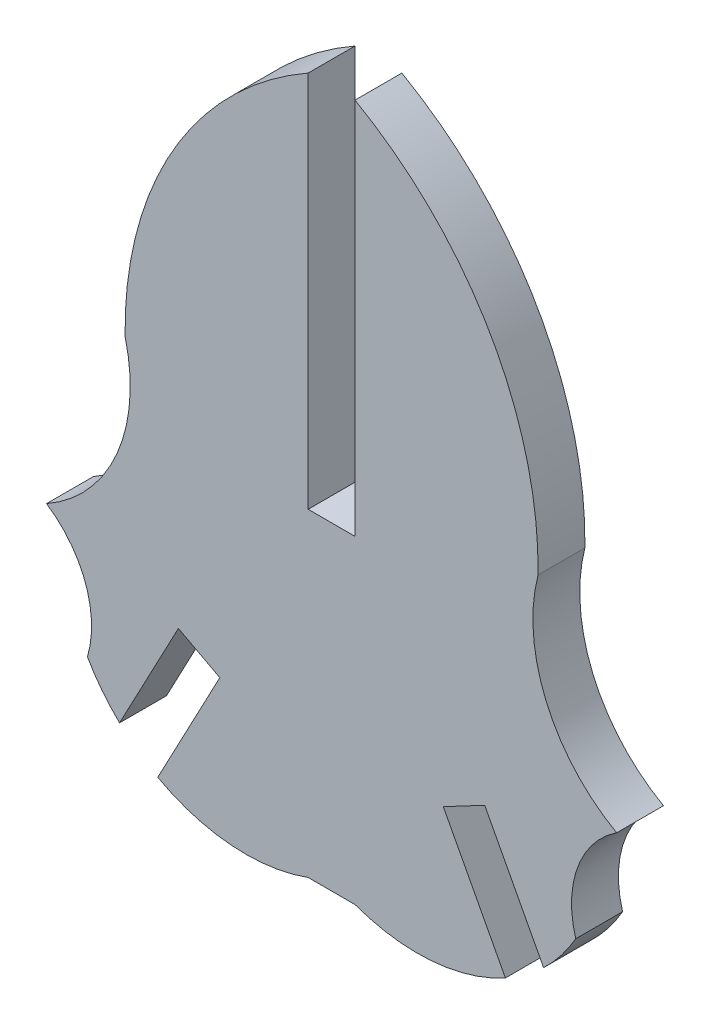
ISO-10303-21;
HEADER;
FILE_DESCRIPTION(('STEP AP214'),'2;1');
FILE_NAME('part.step','',(''),(''),'','','');
FILE_SCHEMA(('AUTOMOTIVE_DESIGN { 1 0 10303 214 1 1 1 1 }'));
ENDSEC;
DATA;
#1=APPLICATION_CONTEXT('core data for automotive mechanical design processes');
#2=APPLICATION_PROTOCOL_DEFINITION('international standard','automotive_design',2000,#1);
#3=PRODUCT_CONTEXT('',#1,'mechanical');
#4=PRODUCT('Part','Part','',(#3));
#5=PRODUCT_RELATED_PRODUCT_CATEGORY('part','',(#4));
#6=PRODUCT_DEFINITION_FORMATION('','',#4);
#7=PRODUCT_DEFINITION_CONTEXT('part definition',#1,'design');
#8=PRODUCT_DEFINITION('design','',#6,#7);
#9=PRODUCT_DEFINITION_SHAPE('','',#8);
#10=(LENGTH_UNIT() NAMED_UNIT(*) SI_UNIT(.MILLI.,.METRE.));
#11=(NAMED_UNIT(*) PLANE_ANGLE_UNIT() SI_UNIT($,.RADIAN.));
#12=(NAMED_UNIT(*) SI_UNIT($,.STERADIAN.) SOLID_ANGLE_UNIT());
#13=UNCERTAINTY_MEASURE_WITH_UNIT(LENGTH_MEASURE(1.E-05),#10,'distance_accuracy_value','');
#14=(GEOMETRIC_REPRESENTATION_CONTEXT(3) GLOBAL_UNCERTAINTY_ASSIGNED_CONTEXT((#13)) GLOBAL_UNIT_ASSIGNED_CONTEXT((#10,
#11,#12)) REPRESENTATION_CONTEXT('',''));
#15=CARTESIAN_POINT('',(0.,0.,0.));
#16=DIRECTION('',(0.,0.,1.));
#17=DIRECTION('',(1.,0.,0.));
#18=AXIS2_PLACEMENT_3D('',#15,#16,#17);
#19=CARTESIAN_POINT('',(1.524,114.851197300558,1.524));
#20=DIRECTION('',(1.,0.,0.));
#21=DIRECTION('',(0.,0.,-1.));
#22=AXIS2_PLACEMENT_3D('',#19,#20,#21);
#23=PLANE('',#22);
#24=DIRECTION('',(0.,-1.,0.));
#25=VECTOR('',#24,1.);
#26=CARTESIAN_POINT('',(1.524,114.851197300558,0.));
#27=LINE('',#26,#25);
#28=CARTESIAN_POINT('',(1.524,127.137521288262,0.));
#29=VERTEX_POINT('',#28);
#30=CARTESIAN_POINT('',(1.524,114.851197300558,0.));
#31=VERTEX_POINT('',#30);
#32=EDGE_CURVE('E201',#29,#31,#27,.T.);
#33=ORIENTED_EDGE('',*,*,#32,.T.);
#34=DIRECTION('',(0.,0.,-1.));
#35=VECTOR('',#34,1.);
#36=CARTESIAN_POINT('',(1.524,114.851197300558,1.524));
#37=LINE('',#36,#35);
#38=CARTESIAN_POINT('',(1.524,114.851197300558,1.524));
#39=VERTEX_POINT('',#38);
#40=EDGE_CURVE('E11',#39,#31,#37,.T.);
#41=ORIENTED_EDGE('',*,*,#40,.F.);
#42=DIRECTION('',(0.,-1.,0.));
#43=VECTOR('',#42,1.);
#44=CARTESIAN_POINT('',(1.524,114.851197300558,1.524));
#45=LINE('',#44,#43);
#46=CARTESIAN_POINT('',(1.524,127.137521288262,1.524));
#47=VERTEX_POINT('',#46);
#48=EDGE_CURVE('E239',#47,#39,#45,.T.);
#49=ORIENTED_EDGE('',*,*,#48,.F.);
#50=DIRECTION('',(0.,0.,-1.));
#51=VECTOR('',#50,1.);
#52=CARTESIAN_POINT('',(1.524,127.137521288262,1.524));
#53=LINE('',#52,#51);
#54=EDGE_CURVE('E197',#47,#29,#53,.T.);
#55=ORIENTED_EDGE('',*,*,#54,.T.);
#56=EDGE_LOOP('',(#33,#41,#49,#55));
#57=FACE_BOUND('',#56,.T.);
#58=ADVANCED_FACE('F33',(#57),#23,.F.);
#59=CARTESIAN_POINT('',(0.,114.851197300558,1.524));
#60=DIRECTION('',(0.,-1.,0.));
#61=DIRECTION('',(0.,0.,-1.));
#62=AXIS2_PLACEMENT_3D('',#59,#60,#61);
#63=PLANE('',#62);
#64=DIRECTION('',(-1.,0.,0.));
#65=VECTOR('',#64,1.);
#66=CARTESIAN_POINT('',(0.,114.851197300558,0.));
#67=LINE('',#66,#65);
#68=CARTESIAN_POINT('',(0.,114.851197300558,0.));
#69=VERTEX_POINT('',#68);
#70=EDGE_CURVE('E204',#31,#69,#67,.T.);
#71=ORIENTED_EDGE('',*,*,#70,.T.);
#72=DIRECTION('',(0.,0.,-1.));
#73=VECTOR('',#72,1.);
#74=CARTESIAN_POINT('',(0.,114.851197300558,1.524));
#75=LINE('',#74,#73);
#76=CARTESIAN_POINT('',(0.,114.851197300558,1.524));
#77=VERTEX_POINT('',#76);
#78=EDGE_CURVE('E41',#77,#69,#75,.T.);
#79=ORIENTED_EDGE('',*,*,#78,.F.);
#80=DIRECTION('',(-1.,0.,0.));
#81=VECTOR('',#80,1.);
#82=CARTESIAN_POINT('',(0.,114.851197300558,1.524));
#83=LINE('',#82,#81);
#84=EDGE_CURVE('E128',#39,#77,#83,.T.);
#85=ORIENTED_EDGE('',*,*,#84,.F.);
#86=ORIENTED_EDGE('',*,*,#40,.T.);
#87=EDGE_LOOP('',(#71,#79,#85,#86));
#88=FACE_BOUND('',#87,.T.);
#89=ADVANCED_FACE('F357',(#88),#63,.F.);
#90=CARTESIAN_POINT('',(0.,114.851197300558,1.524));
#91=DIRECTION('',(-1.,0.,0.));
#92=DIRECTION('',(0.,0.,1.));
#93=AXIS2_PLACEMENT_3D('',#90,#91,#92);
#94=PLANE('',#93);
#95=DIRECTION('',(0.,1.,0.));
#96=VECTOR('',#95,1.);
#97=CARTESIAN_POINT('',(0.,114.851197300558,0.));
#98=LINE('',#97,#96);
#99=CARTESIAN_POINT('',(0.,127.137521288262,0.));
#100=VERTEX_POINT('',#99);
#101=EDGE_CURVE('E206',#69,#100,#98,.T.);
#102=ORIENTED_EDGE('',*,*,#101,.T.);
#103=DIRECTION('',(0.,0.,-1.));
#104=VECTOR('',#103,1.);
#105=CARTESIAN_POINT('',(0.,127.137521288262,1.524));
#106=LINE('',#105,#104);
#107=CARTESIAN_POINT('',(0.,127.137521288262,1.524));
#108=VERTEX_POINT('',#107);
#109=EDGE_CURVE('E282',#108,#100,#106,.T.);
#110=ORIENTED_EDGE('',*,*,#109,.F.);
#111=DIRECTION('',(0.,1.,0.));
#112=VECTOR('',#111,1.);
#113=CARTESIAN_POINT('',(0.,114.851197300558,1.524));
#114=LINE('',#113,#112);
#115=EDGE_CURVE('E290',#77,#108,#114,.T.);
#116=ORIENTED_EDGE('',*,*,#115,.F.);
#117=ORIENTED_EDGE('',*,*,#78,.T.);
#118=EDGE_LOOP('',(#102,#110,#116,#117));
#119=FACE_BOUND('',#118,.T.);
#120=ADVANCED_FACE('F288',(#119),#94,.F.);
#121=CARTESIAN_POINT('',(5.7953461840348,116.916816544472,1.524));
#122=DIRECTION('',(0.,0.,-1.));
#123=DIRECTION('',(-1.,0.,0.));
#124=AXIS2_PLACEMENT_3D('',#121,#122,#123);
#125=CYLINDRICAL_SURFACE('',#124,11.7494188304156);
#126=CARTESIAN_POINT('',(5.7953461840348,116.916816544472,0.));
#127=DIRECTION('',(0.,0.,1.));
#128=DIRECTION('',(1.,0.,0.));
#129=AXIS2_PLACEMENT_3D('',#126,#127,#128);
#130=CIRCLE('',#129,11.7494188304156);
#131=CARTESIAN_POINT('',(-5.95274690538247,116.740318343602,0.));
#132=VERTEX_POINT('',#131);
#133=EDGE_CURVE('E208',#100,#132,#130,.T.);
#134=ORIENTED_EDGE('',*,*,#133,.T.);
#135=DIRECTION('',(0.,0.,-1.));
#136=VECTOR('',#135,1.);
#137=CARTESIAN_POINT('',(-5.95274690538247,116.740318343602,1.524));
#138=LINE('',#137,#136);
#139=CARTESIAN_POINT('',(-5.95274690538247,116.740318343602,1.524));
#140=VERTEX_POINT('',#139);
#141=EDGE_CURVE('E279',#140,#132,#138,.T.);
#142=ORIENTED_EDGE('',*,*,#141,.F.);
#143=CARTESIAN_POINT('',(5.7953461840348,116.916816544472,1.524));
#144=DIRECTION('',(0.,0.,1.));
#145=DIRECTION('',(1.,0.,0.));
#146=AXIS2_PLACEMENT_3D('',#143,#144,#145);
#147=CIRCLE('',#146,11.7494188304156);
#148=EDGE_CURVE('E308',#108,#140,#147,.T.);
#149=ORIENTED_EDGE('',*,*,#148,.F.);
#150=ORIENTED_EDGE('',*,*,#109,.T.);
#151=EDGE_LOOP('',(#134,#142,#149,#150));
#152=FACE_BOUND('',#151,.T.);
#153=ADVANCED_FACE('F299',(#152),#125,.T.);
#154=CARTESIAN_POINT('',(-11.1300085073487,115.413975941409,1.524));
#155=DIRECTION('',(0.,0.,-1.));
#156=DIRECTION('',(-1.,0.,0.));
#157=AXIS2_PLACEMENT_3D('',#154,#155,#156);
#158=CYLINDRICAL_SURFACE('',#157,5.34445711583969);
#159=CARTESIAN_POINT('',(-11.1300085073487,115.413975941409,0.));
#160=DIRECTION('',(0.,0.,-1.));
#161=DIRECTION('',(-1.,0.,0.));
#162=AXIS2_PLACEMENT_3D('',#159,#160,#161);
#163=CIRCLE('',#162,5.34445711583969);
#164=CARTESIAN_POINT('',(-8.50870740255857,110.756508562986,0.));
#165=VERTEX_POINT('',#164);
#166=EDGE_CURVE('E210',#132,#165,#163,.T.);
#167=ORIENTED_EDGE('',*,*,#166,.T.);
#168=DIRECTION('',(0.,0.,-1.));
#169=VECTOR('',#168,1.);
#170=CARTESIAN_POINT('',(-8.50870740255857,110.756508562986,1.524));
#171=LINE('',#170,#169);
#172=CARTESIAN_POINT('',(-8.50870740255857,110.756508562986,1.524));
#173=VERTEX_POINT('',#172);
#174=EDGE_CURVE('E276',#173,#165,#171,.T.);
#175=ORIENTED_EDGE('',*,*,#174,.F.);
#176=CARTESIAN_POINT('',(-11.1300085073487,115.413975941409,1.524));
#177=DIRECTION('',(0.,0.,-1.));
#178=DIRECTION('',(-1.,0.,0.));
#179=AXIS2_PLACEMENT_3D('',#176,#177,#178);
#180=CIRCLE('',#179,5.34445711583969);
#181=EDGE_CURVE('E305',#140,#173,#180,.T.);
#182=ORIENTED_EDGE('',*,*,#181,.F.);
#183=ORIENTED_EDGE('',*,*,#141,.T.);
#184=EDGE_LOOP('',(#167,#175,#182,#183));
#185=FACE_BOUND('',#184,.T.);
#186=ADVANCED_FACE('F303',(#185),#158,.F.);
#187=CARTESIAN_POINT('',(-10.2981873988656,108.036270692932,1.524));
#188=DIRECTION('',(0.,0.,-1.));
#189=DIRECTION('',(-1.,0.,0.));
#190=AXIS2_PLACEMENT_3D('',#187,#188,#189);
#191=CYLINDRICAL_SURFACE('',#190,3.25606092185918);
#192=CARTESIAN_POINT('',(-10.2981873988656,108.036270692932,0.));
#193=DIRECTION('',(0.,0.,-1.));
#194=DIRECTION('',(1.,0.,0.));
#195=AXIS2_PLACEMENT_3D('',#192,#193,#194);
#196=CIRCLE('',#195,3.25606092185918);
#197=CARTESIAN_POINT('',(-7.17791901668704,107.105755808561,0.));
#198=VERTEX_POINT('',#197);
#199=EDGE_CURVE('E212',#165,#198,#196,.T.);
#200=ORIENTED_EDGE('',*,*,#199,.T.);
#201=DIRECTION('',(0.,0.,-1.));
#202=VECTOR('',#201,1.);
#203=CARTESIAN_POINT('',(-7.17791901668704,107.105755808561,1.524));
#204=LINE('',#203,#202);
#205=CARTESIAN_POINT('',(-7.17791901668704,107.105755808561,1.524));
#206=VERTEX_POINT('',#205);
#207=EDGE_CURVE('E273',#206,#198,#204,.T.);
#208=ORIENTED_EDGE('',*,*,#207,.F.);
#209=CARTESIAN_POINT('',(-10.2981873988656,108.036270692932,1.524));
#210=DIRECTION('',(0.,0.,-1.));
#211=DIRECTION('',(1.,0.,0.));
#212=AXIS2_PLACEMENT_3D('',#209,#210,#211);
#213=CIRCLE('',#212,3.25606092185918);
#214=EDGE_CURVE('E307',#173,#206,#213,.T.);
#215=ORIENTED_EDGE('',*,*,#214,.F.);
#216=ORIENTED_EDGE('',*,*,#174,.T.);
#217=EDGE_LOOP('',(#200,#208,#215,#216));
#218=FACE_BOUND('',#217,.T.);
#219=ADVANCED_FACE('F370',(#218),#191,.F.);
#220=CARTESIAN_POINT('',(-2.02983197494485,110.055759341289,1.524));
#221=DIRECTION('',(0.,0.,-1.));
#222=DIRECTION('',(-1.,0.,0.));
#223=AXIS2_PLACEMENT_3D('',#220,#221,#222);
#224=CYLINDRICAL_SURFACE('',#223,5.93340720264993);
#225=CARTESIAN_POINT('',(-2.02983197494485,110.055759341289,0.));
#226=DIRECTION('',(0.,0.,1.));
#227=DIRECTION('',(-1.,0.,0.));
#228=AXIS2_PLACEMENT_3D('',#225,#226,#227);
#229=CIRCLE('',#228,5.93340720264993);
#230=CARTESIAN_POINT('',(-6.13265444949957,105.76948254496,0.));
#231=VERTEX_POINT('',#230);
#232=EDGE_CURVE('E214',#198,#231,#229,.T.);
#233=ORIENTED_EDGE('',*,*,#232,.T.);
#234=DIRECTION('',(0.,0.,-1.));
#235=VECTOR('',#234,1.);
#236=CARTESIAN_POINT('',(-6.13265444949957,105.76948254496,1.524));
#237=LINE('',#236,#235);
#238=CARTESIAN_POINT('',(-6.13265444949957,105.76948254496,1.524));
#239=VERTEX_POINT('',#238);
#240=EDGE_CURVE('E270',#239,#231,#237,.T.);
#241=ORIENTED_EDGE('',*,*,#240,.F.);
#242=CARTESIAN_POINT('',(-2.02983197494485,110.055759341289,1.524));
#243=DIRECTION('',(0.,0.,1.));
#244=DIRECTION('',(-1.,0.,0.));
#245=AXIS2_PLACEMENT_3D('',#242,#243,#244);
#246=CIRCLE('',#245,5.93340720264993);
#247=EDGE_CURVE('E310',#206,#239,#246,.T.);
#248=ORIENTED_EDGE('',*,*,#247,.F.);
#249=ORIENTED_EDGE('',*,*,#207,.T.);
#250=EDGE_LOOP('',(#233,#241,#248,#249));
#251=FACE_BOUND('',#250,.T.);
#252=ADVANCED_FACE('F373',(#251),#224,.T.);
#253=CARTESIAN_POINT('',(-6.13265444949957,105.76948254496,1.524));
#254=DIRECTION('',(-0.88386141755622,0.467748858422453,0.));
#255=DIRECTION('',(-0.467748858422453,-0.883861417556221,0.));
#256=AXIS2_PLACEMENT_3D('',#253,#254,#255);
#257=PLANE('',#256);
#258=DIRECTION('',(0.467748858422453,0.88386141755622,0.));
#259=VECTOR('',#258,1.);
#260=CARTESIAN_POINT('',(-6.13265444949957,105.76948254496,0.));
#261=LINE('',#260,#259);
#262=CARTESIAN_POINT('',(-4.21858354193314,109.386323922982,0.));
#263=VERTEX_POINT('',#262);
#264=EDGE_CURVE('E216',#231,#263,#261,.T.);
#265=ORIENTED_EDGE('',*,*,#264,.T.);
#266=DIRECTION('',(0.,0.,-1.));
#267=VECTOR('',#266,1.);
#268=CARTESIAN_POINT('',(-4.21858354193314,109.386323922982,1.524));
#269=LINE('',#268,#267);
#270=CARTESIAN_POINT('',(-4.21858354193314,109.386323922982,1.524));
#271=VERTEX_POINT('',#270);
#272=EDGE_CURVE('E267',#271,#263,#269,.T.);
#273=ORIENTED_EDGE('',*,*,#272,.F.);
#274=DIRECTION('',(0.467748858422453,0.88386141755622,0.));
#275=VECTOR('',#274,1.);
#276=CARTESIAN_POINT('',(-6.13265444949957,105.76948254496,1.524));
#277=LINE('',#276,#275);
#278=EDGE_CURVE('E316',#239,#271,#277,.T.);
#279=ORIENTED_EDGE('',*,*,#278,.F.);
#280=ORIENTED_EDGE('',*,*,#240,.T.);
#281=EDGE_LOOP('',(#265,#273,#279,#280));
#282=FACE_BOUND('',#281,.T.);
#283=ADVANCED_FACE('F377',(#282),#257,.F.);
#284=CARTESIAN_POINT('',(-4.21858354193314,109.386323922982,1.524));
#285=DIRECTION('',(0.467748858422454,0.88386141755622,0.));
#286=DIRECTION('',(-0.88386141755622,0.467748858422455,0.));
#287=AXIS2_PLACEMENT_3D('',#284,#285,#286);
#288=PLANE('',#287);
#289=DIRECTION('',(0.88386141755622,-0.467748858422454,0.));
#290=VECTOR('',#289,1.);
#291=CARTESIAN_POINT('',(-4.21858354193314,109.386323922982,0.));
#292=LINE('',#291,#290);
#293=CARTESIAN_POINT('',(-2.87157874157746,108.673474662746,0.));
#294=VERTEX_POINT('',#293);
#295=EDGE_CURVE('E218',#263,#294,#292,.T.);
#296=ORIENTED_EDGE('',*,*,#295,.T.);
#297=DIRECTION('',(0.,0.,-1.));
#298=VECTOR('',#297,1.);
#299=CARTESIAN_POINT('',(-2.87157874157746,108.673474662746,1.524));
#300=LINE('',#299,#298);
#301=CARTESIAN_POINT('',(-2.87157874157746,108.673474662746,1.524));
#302=VERTEX_POINT('',#301);
#303=EDGE_CURVE('E264',#302,#294,#300,.T.);
#304=ORIENTED_EDGE('',*,*,#303,.F.);
#305=DIRECTION('',(0.88386141755622,-0.467748858422454,0.));
#306=VECTOR('',#305,1.);
#307=CARTESIAN_POINT('',(-4.21858354193314,109.386323922982,1.524));
#308=LINE('',#307,#306);
#309=EDGE_CURVE('E318',#271,#302,#308,.T.);
#310=ORIENTED_EDGE('',*,*,#309,.F.);
#311=ORIENTED_EDGE('',*,*,#272,.T.);
#312=EDGE_LOOP('',(#296,#304,#310,#311));
#313=FACE_BOUND('',#312,.T.);
#314=ADVANCED_FACE('F381',(#313),#288,.F.);
#315=CARTESIAN_POINT('',(-4.89091282582464,104.857727271631,1.524));
#316=DIRECTION('',(0.88386141755622,-0.467748858422454,0.));
#317=DIRECTION('',(0.467748858422454,0.88386141755622,0.));
#318=AXIS2_PLACEMENT_3D('',#315,#316,#317);
#319=PLANE('',#318);
#320=DIRECTION('',(-0.467748858422454,-0.88386141755622,0.));
#321=VECTOR('',#320,1.);
#322=CARTESIAN_POINT('',(-4.89091282582464,104.857727271631,0.));
#323=LINE('',#322,#321);
#324=CARTESIAN_POINT('',(-4.89091282582464,104.857727271631,0.));
#325=VERTEX_POINT('',#324);
#326=EDGE_CURVE('E220',#294,#325,#323,.T.);
#327=ORIENTED_EDGE('',*,*,#326,.T.);
#328=DIRECTION('',(0.,0.,-1.));
#329=VECTOR('',#328,1.);
#330=CARTESIAN_POINT('',(-4.89091282582464,104.857727271631,1.524));
#331=LINE('',#330,#329);
#332=CARTESIAN_POINT('',(-4.89091282582464,104.857727271631,1.524));
#333=VERTEX_POINT('',#332);
#334=EDGE_CURVE('E261',#333,#325,#331,.T.);
#335=ORIENTED_EDGE('',*,*,#334,.F.);
#336=DIRECTION('',(-0.467748858422454,-0.88386141755622,0.));
#337=VECTOR('',#336,1.);
#338=CARTESIAN_POINT('',(-4.89091282582464,104.857727271631,1.524));
#339=LINE('',#338,#337);
#340=EDGE_CURVE('E320',#302,#333,#339,.T.);
#341=ORIENTED_EDGE('',*,*,#340,.F.);
#342=ORIENTED_EDGE('',*,*,#303,.T.);
#343=EDGE_LOOP('',(#327,#335,#341,#342));
#344=FACE_BOUND('',#343,.T.);
#345=ADVANCED_FACE('F385',(#344),#319,.F.);
#346=CARTESIAN_POINT('',(-2.02983197494485,110.055759341289,1.524));
#347=DIRECTION('',(0.,0.,-1.));
#348=DIRECTION('',(-1.,0.,0.));
#349=AXIS2_PLACEMENT_3D('',#346,#347,#348);
#350=CYLINDRICAL_SURFACE('',#349,5.93340720264992);
#351=CARTESIAN_POINT('',(-2.02983197494485,110.055759341289,0.));
#352=DIRECTION('',(0.,0.,1.));
#353=DIRECTION('',(-1.,0.,0.));
#354=AXIS2_PLACEMENT_3D('',#351,#352,#353);
#355=CIRCLE('',#354,5.93340720264992);
#356=CARTESIAN_POINT('',(0.,104.480357724728,0.));
#357=VERTEX_POINT('',#356);
#358=EDGE_CURVE('E222',#325,#357,#355,.T.);
#359=ORIENTED_EDGE('',*,*,#358,.T.);
#360=DIRECTION('',(0.,0.,-1.));
#361=VECTOR('',#360,1.);
#362=CARTESIAN_POINT('',(0.,104.480357724728,1.524));
#363=LINE('',#362,#361);
#364=CARTESIAN_POINT('',(0.,104.480357724728,1.524));
#365=VERTEX_POINT('',#364);
#366=EDGE_CURVE('E258',#365,#357,#363,.T.);
#367=ORIENTED_EDGE('',*,*,#366,.F.);
#368=CARTESIAN_POINT('',(-2.02983197494485,110.055759341289,1.524));
#369=DIRECTION('',(0.,0.,1.));
#370=DIRECTION('',(-1.,0.,0.));
#371=AXIS2_PLACEMENT_3D('',#368,#369,#370);
#372=CIRCLE('',#371,5.93340720264992);
#373=EDGE_CURVE('E322',#333,#365,#372,.T.);
#374=ORIENTED_EDGE('',*,*,#373,.F.);
#375=ORIENTED_EDGE('',*,*,#334,.T.);
#376=EDGE_LOOP('',(#359,#367,#374,#375));
#377=FACE_BOUND('',#376,.T.);
#378=ADVANCED_FACE('F389',(#377),#350,.T.);
#379=CARTESIAN_POINT('',(0.,104.480357724728,1.524));
#380=DIRECTION('',(0.,1.,0.));
#381=DIRECTION('',(0.,0.,1.));
#382=AXIS2_PLACEMENT_3D('',#379,#380,#381);
#383=PLANE('',#382);
#384=DIRECTION('',(1.,0.,0.));
#385=VECTOR('',#384,1.);
#386=CARTESIAN_POINT('',(0.,104.480357724728,0.));
#387=LINE('',#386,#385);
#388=CARTESIAN_POINT('',(1.524,104.480357724728,0.));
#389=VERTEX_POINT('',#388);
#390=EDGE_CURVE('E224',#357,#389,#387,.T.);
#391=ORIENTED_EDGE('',*,*,#390,.T.);
#392=DIRECTION('',(0.,0.,-1.));
#393=VECTOR('',#392,1.);
#394=CARTESIAN_POINT('',(1.524,104.480357724728,1.524));
#395=LINE('',#394,#393);
#396=CARTESIAN_POINT('',(1.524,104.480357724728,1.524));
#397=VERTEX_POINT('',#396);
#398=EDGE_CURVE('E255',#397,#389,#395,.T.);
#399=ORIENTED_EDGE('',*,*,#398,.F.);
#400=DIRECTION('',(1.,0.,0.));
#401=VECTOR('',#400,1.);
#402=CARTESIAN_POINT('',(0.,104.480357724728,1.524));
#403=LINE('',#402,#401);
#404=EDGE_CURVE('E324',#365,#397,#403,.T.);
#405=ORIENTED_EDGE('',*,*,#404,.F.);
#406=ORIENTED_EDGE('',*,*,#366,.T.);
#407=EDGE_LOOP('',(#391,#399,#405,#406));
#408=FACE_BOUND('',#407,.T.);
#409=ADVANCED_FACE('F393',(#408),#383,.F.);
#410=CARTESIAN_POINT('',(3.55383197494485,110.055759341289,1.524));
#411=DIRECTION('',(0.,0.,-1.));
#412=DIRECTION('',(-1.,0.,0.));
#413=AXIS2_PLACEMENT_3D('',#410,#411,#412);
#414=CYLINDRICAL_SURFACE('',#413,5.93340720264992);
#415=CARTESIAN_POINT('',(3.55383197494485,110.055759341289,0.));
#416=DIRECTION('',(0.,0.,1.));
#417=DIRECTION('',(1.,0.,0.));
#418=AXIS2_PLACEMENT_3D('',#415,#416,#417);
#419=CIRCLE('',#418,5.93340720264992);
#420=CARTESIAN_POINT('',(6.41491282582464,104.857727271631,0.));
#421=VERTEX_POINT('',#420);
#422=EDGE_CURVE('E226',#389,#421,#419,.T.);
#423=ORIENTED_EDGE('',*,*,#422,.T.);
#424=DIRECTION('',(0.,0.,-1.));
#425=VECTOR('',#424,1.);
#426=CARTESIAN_POINT('',(6.41491282582464,104.857727271631,1.524));
#427=LINE('',#426,#425);
#428=CARTESIAN_POINT('',(6.41491282582464,104.857727271631,1.524));
#429=VERTEX_POINT('',#428);
#430=EDGE_CURVE('E252',#429,#421,#427,.T.);
#431=ORIENTED_EDGE('',*,*,#430,.F.);
#432=CARTESIAN_POINT('',(3.55383197494485,110.055759341289,1.524));
#433=DIRECTION('',(0.,0.,1.));
#434=DIRECTION('',(1.,0.,0.));
#435=AXIS2_PLACEMENT_3D('',#432,#433,#434);
#436=CIRCLE('',#435,5.93340720264992);
#437=EDGE_CURVE('E326',#397,#429,#436,.T.);
#438=ORIENTED_EDGE('',*,*,#437,.F.);
#439=ORIENTED_EDGE('',*,*,#398,.T.);
#440=EDGE_LOOP('',(#423,#431,#438,#439));
#441=FACE_BOUND('',#440,.T.);
#442=ADVANCED_FACE('F397',(#441),#414,.T.);
#443=CARTESIAN_POINT('',(6.41491282582464,104.857727271631,1.524));
#444=DIRECTION('',(-0.88386141755622,-0.467748858422454,0.));
#445=DIRECTION('',(0.467748858422454,-0.88386141755622,0.));
#446=AXIS2_PLACEMENT_3D('',#443,#444,#445);
#447=PLANE('',#446);
#448=DIRECTION('',(-0.467748858422454,0.88386141755622,0.));
#449=VECTOR('',#448,1.);
#450=CARTESIAN_POINT('',(6.41491282582464,104.857727271631,0.));
#451=LINE('',#450,#449);
#452=CARTESIAN_POINT('',(4.39557874157746,108.673474662746,0.));
#453=VERTEX_POINT('',#452);
#454=EDGE_CURVE('E228',#421,#453,#451,.T.);
#455=ORIENTED_EDGE('',*,*,#454,.T.);
#456=DIRECTION('',(0.,0.,-1.));
#457=VECTOR('',#456,1.);
#458=CARTESIAN_POINT('',(4.39557874157746,108.673474662746,1.524));
#459=LINE('',#458,#457);
#460=CARTESIAN_POINT('',(4.39557874157746,108.673474662746,1.524));
#461=VERTEX_POINT('',#460);
#462=EDGE_CURVE('E249',#461,#453,#459,.T.);
#463=ORIENTED_EDGE('',*,*,#462,.F.);
#464=DIRECTION('',(-0.467748858422454,0.88386141755622,0.));
#465=VECTOR('',#464,1.);
#466=CARTESIAN_POINT('',(6.41491282582464,104.857727271631,1.524));
#467=LINE('',#466,#465);
#468=EDGE_CURVE('E328',#429,#461,#467,.T.);
#469=ORIENTED_EDGE('',*,*,#468,.F.);
#470=ORIENTED_EDGE('',*,*,#430,.T.);
#471=EDGE_LOOP('',(#455,#463,#469,#470));
#472=FACE_BOUND('',#471,.T.);
#473=ADVANCED_FACE('F401',(#472),#447,.F.);
#474=CARTESIAN_POINT('',(5.74258354193314,109.386323922982,1.524));
#475=DIRECTION('',(-0.467748858422454,0.88386141755622,0.));
#476=DIRECTION('',(-0.88386141755622,-0.467748858422454,0.));
#477=AXIS2_PLACEMENT_3D('',#474,#475,#476);
#478=PLANE('',#477);
#479=DIRECTION('',(0.88386141755622,0.467748858422454,0.));
#480=VECTOR('',#479,1.);
#481=CARTESIAN_POINT('',(5.74258354193314,109.386323922982,0.));
#482=LINE('',#481,#480);
#483=CARTESIAN_POINT('',(5.74258354193314,109.386323922982,0.));
#484=VERTEX_POINT('',#483);
#485=EDGE_CURVE('E230',#453,#484,#482,.T.);
#486=ORIENTED_EDGE('',*,*,#485,.T.);
#487=DIRECTION('',(0.,0.,-1.));
#488=VECTOR('',#487,1.);
#489=CARTESIAN_POINT('',(5.74258354193314,109.386323922982,1.524));
#490=LINE('',#489,#488);
#491=CARTESIAN_POINT('',(5.74258354193314,109.386323922982,1.524));
#492=VERTEX_POINT('',#491);
#493=EDGE_CURVE('E246',#492,#484,#490,.T.);
#494=ORIENTED_EDGE('',*,*,#493,.F.);
#495=DIRECTION('',(0.88386141755622,0.467748858422454,0.));
#496=VECTOR('',#495,1.);
#497=CARTESIAN_POINT('',(5.74258354193314,109.386323922982,1.524));
#498=LINE('',#497,#496);
#499=EDGE_CURVE('E330',#461,#492,#498,.T.);
#500=ORIENTED_EDGE('',*,*,#499,.F.);
#501=ORIENTED_EDGE('',*,*,#462,.T.);
#502=EDGE_LOOP('',(#486,#494,#500,#501));
#503=FACE_BOUND('',#502,.T.);
#504=ADVANCED_FACE('F405',(#503),#478,.F.);
#505=CARTESIAN_POINT('',(7.65665444949957,105.76948254496,1.524));
#506=DIRECTION('',(0.88386141755622,0.467748858422453,0.));
#507=DIRECTION('',(-0.467748858422453,0.883861417556221,0.));
#508=AXIS2_PLACEMENT_3D('',#505,#506,#507);
#509=PLANE('',#508);
#510=DIRECTION('',(0.467748858422453,-0.88386141755622,0.));
#511=VECTOR('',#510,1.);
#512=CARTESIAN_POINT('',(7.65665444949957,105.76948254496,0.));
#513=LINE('',#512,#511);
#514=CARTESIAN_POINT('',(7.65665444949957,105.76948254496,0.));
#515=VERTEX_POINT('',#514);
#516=EDGE_CURVE('E232',#484,#515,#513,.T.);
#517=ORIENTED_EDGE('',*,*,#516,.T.);
#518=DIRECTION('',(0.,0.,-1.));
#519=VECTOR('',#518,1.);
#520=CARTESIAN_POINT('',(7.65665444949957,105.76948254496,1.524));
#521=LINE('',#520,#519);
#522=CARTESIAN_POINT('',(7.65665444949957,105.76948254496,1.524));
#523=VERTEX_POINT('',#522);
#524=EDGE_CURVE('E243',#523,#515,#521,.T.);
#525=ORIENTED_EDGE('',*,*,#524,.F.);
#526=DIRECTION('',(0.467748858422453,-0.88386141755622,0.));
#527=VECTOR('',#526,1.);
#528=CARTESIAN_POINT('',(7.65665444949957,105.76948254496,1.524));
#529=LINE('',#528,#527);
#530=EDGE_CURVE('E332',#492,#523,#529,.T.);
#531=ORIENTED_EDGE('',*,*,#530,.F.);
#532=ORIENTED_EDGE('',*,*,#493,.T.);
#533=EDGE_LOOP('',(#517,#525,#531,#532));
#534=FACE_BOUND('',#533,.T.);
#535=ADVANCED_FACE('F338',(#534),#509,.F.);
#536=CARTESIAN_POINT('',(3.55383197494485,110.055759341289,1.524));
#537=DIRECTION('',(0.,0.,-1.));
#538=DIRECTION('',(-1.,0.,0.));
#539=AXIS2_PLACEMENT_3D('',#536,#537,#538);
#540=CYLINDRICAL_SURFACE('',#539,5.93340720264993);
#541=CARTESIAN_POINT('',(3.55383197494485,110.055759341289,0.));
#542=DIRECTION('',(0.,0.,1.));
#543=DIRECTION('',(1.,0.,0.));
#544=AXIS2_PLACEMENT_3D('',#541,#542,#543);
#545=CIRCLE('',#544,5.93340720264993);
#546=CARTESIAN_POINT('',(8.70191901668704,107.105755808561,0.));
#547=VERTEX_POINT('',#546);
#548=EDGE_CURVE('E234',#515,#547,#545,.T.);
#549=ORIENTED_EDGE('',*,*,#548,.T.);
#550=DIRECTION('',(0.,0.,-1.));
#551=VECTOR('',#550,1.);
#552=CARTESIAN_POINT('',(8.70191901668704,107.105755808561,1.524));
#553=LINE('',#552,#551);
#554=CARTESIAN_POINT('',(8.70191901668704,107.105755808561,1.524));
#555=VERTEX_POINT('',#554);
#556=EDGE_CURVE('E192',#555,#547,#553,.T.);
#557=ORIENTED_EDGE('',*,*,#556,.F.);
#558=CARTESIAN_POINT('',(3.55383197494485,110.055759341289,1.524));
#559=DIRECTION('',(0.,0.,1.));
#560=DIRECTION('',(1.,0.,0.));
#561=AXIS2_PLACEMENT_3D('',#558,#559,#560);
#562=CIRCLE('',#561,5.93340720264993);
#563=EDGE_CURVE('E183',#523,#555,#562,.T.);
#564=ORIENTED_EDGE('',*,*,#563,.F.);
#565=ORIENTED_EDGE('',*,*,#524,.T.);
#566=EDGE_LOOP('',(#549,#557,#564,#565));
#567=FACE_BOUND('',#566,.T.);
#568=ADVANCED_FACE('F342',(#567),#540,.T.);
#569=CARTESIAN_POINT('',(11.8221873988656,108.036270692932,1.524));
#570=DIRECTION('',(0.,0.,-1.));
#571=DIRECTION('',(-1.,0.,0.));
#572=AXIS2_PLACEMENT_3D('',#569,#570,#571);
#573=CYLINDRICAL_SURFACE('',#572,3.25606092185918);
#574=CARTESIAN_POINT('',(11.8221873988656,108.036270692932,0.));
#575=DIRECTION('',(0.,0.,-1.));
#576=DIRECTION('',(-1.,0.,0.));
#577=AXIS2_PLACEMENT_3D('',#574,#575,#576);
#578=CIRCLE('',#577,3.25606092185918);
#579=CARTESIAN_POINT('',(10.0327074025586,110.756508562986,0.));
#580=VERTEX_POINT('',#579);
#581=EDGE_CURVE('E191',#547,#580,#578,.T.);
#582=ORIENTED_EDGE('',*,*,#581,.T.);
#583=DIRECTION('',(0.,0.,-1.));
#584=VECTOR('',#583,1.);
#585=CARTESIAN_POINT('',(10.0327074025586,110.756508562986,1.524));
#586=LINE('',#585,#584);
#587=CARTESIAN_POINT('',(10.0327074025586,110.756508562986,1.524));
#588=VERTEX_POINT('',#587);
#589=EDGE_CURVE('E188',#588,#580,#586,.T.);
#590=ORIENTED_EDGE('',*,*,#589,.F.);
#591=CARTESIAN_POINT('',(11.8221873988656,108.036270692932,1.524));
#592=DIRECTION('',(0.,0.,-1.));
#593=DIRECTION('',(-1.,0.,0.));
#594=AXIS2_PLACEMENT_3D('',#591,#592,#593);
#595=CIRCLE('',#594,3.25606092185918);
#596=EDGE_CURVE('E177',#555,#588,#595,.T.);
#597=ORIENTED_EDGE('',*,*,#596,.F.);
#598=ORIENTED_EDGE('',*,*,#556,.T.);
#599=EDGE_LOOP('',(#582,#590,#597,#598));
#600=FACE_BOUND('',#599,.T.);
#601=ADVANCED_FACE('F189',(#600),#573,.F.);
#602=CARTESIAN_POINT('',(12.6540085073487,115.413975941409,1.524));
#603=DIRECTION('',(0.,0.,-1.));
#604=DIRECTION('',(-1.,0.,0.));
#605=AXIS2_PLACEMENT_3D('',#602,#603,#604);
#606=CYLINDRICAL_SURFACE('',#605,5.34445711583969);
#607=CARTESIAN_POINT('',(12.6540085073487,115.413975941409,0.));
#608=DIRECTION('',(0.,0.,-1.));
#609=DIRECTION('',(1.,0.,0.));
#610=AXIS2_PLACEMENT_3D('',#607,#608,#609);
#611=CIRCLE('',#610,5.34445711583969);
#612=CARTESIAN_POINT('',(7.47674690538247,116.740318343602,0.));
#613=VERTEX_POINT('',#612);
#614=EDGE_CURVE('E114',#580,#613,#611,.T.);
#615=ORIENTED_EDGE('',*,*,#614,.T.);
#616=DIRECTION('',(0.,0.,-1.));
#617=VECTOR('',#616,1.);
#618=CARTESIAN_POINT('',(7.47674690538247,116.740318343602,1.524));
#619=LINE('',#618,#617);
#620=CARTESIAN_POINT('',(7.47674690538247,116.740318343602,1.524));
#621=VERTEX_POINT('',#620);
#622=EDGE_CURVE('E193',#621,#613,#619,.T.);
#623=ORIENTED_EDGE('',*,*,#622,.F.);
#624=CARTESIAN_POINT('',(12.6540085073487,115.413975941409,1.524));
#625=DIRECTION('',(0.,0.,-1.));
#626=DIRECTION('',(1.,0.,0.));
#627=AXIS2_PLACEMENT_3D('',#624,#625,#626);
#628=CIRCLE('',#627,5.34445711583969);
#629=EDGE_CURVE('E181',#588,#621,#628,.T.);
#630=ORIENTED_EDGE('',*,*,#629,.F.);
#631=ORIENTED_EDGE('',*,*,#589,.T.);
#632=EDGE_LOOP('',(#615,#623,#630,#631));
#633=FACE_BOUND('',#632,.T.);
#634=ADVANCED_FACE('F195',(#633),#606,.F.);
#635=CARTESIAN_POINT('',(-4.2713461840348,116.916816544472,1.524));
#636=DIRECTION('',(0.,0.,-1.));
#637=DIRECTION('',(-1.,0.,0.));
#638=AXIS2_PLACEMENT_3D('',#635,#636,#637);
#639=CYLINDRICAL_SURFACE('',#638,11.7494188304156);
#640=CARTESIAN_POINT('',(-4.2713461840348,116.916816544472,0.));
#641=DIRECTION('',(0.,0.,1.));
#642=DIRECTION('',(-1.,0.,0.));
#643=AXIS2_PLACEMENT_3D('',#640,#641,#642);
#644=CIRCLE('',#643,11.7494188304156);
#645=EDGE_CURVE('E120',#613,#29,#644,.T.);
#646=ORIENTED_EDGE('',*,*,#645,.T.);
#647=ORIENTED_EDGE('',*,*,#54,.F.);
#648=CARTESIAN_POINT('',(-4.2713461840348,116.916816544472,1.524));
#649=DIRECTION('',(0.,0.,1.));
#650=DIRECTION('',(-1.,0.,0.));
#651=AXIS2_PLACEMENT_3D('',#648,#649,#650);
#652=CIRCLE('',#651,11.7494188304156);
#653=EDGE_CURVE('E49',#621,#47,#652,.T.);
#654=ORIENTED_EDGE('',*,*,#653,.F.);
#655=ORIENTED_EDGE('',*,*,#622,.T.);
#656=EDGE_LOOP('',(#646,#647,#654,#655));
#657=FACE_BOUND('',#656,.T.);
#658=ADVANCED_FACE('F346',(#657),#639,.T.);
#659=CARTESIAN_POINT('',(-4.2713461840348,116.916816544472,1.524));
#660=DIRECTION('',(0.,0.,-1.));
#661=DIRECTION('',(-1.,0.,0.));
#662=AXIS2_PLACEMENT_3D('',#659,#660,#661);
#663=PLANE('',#662);
#664=ORIENTED_EDGE('',*,*,#48,.T.);
#665=ORIENTED_EDGE('',*,*,#84,.T.);
#666=ORIENTED_EDGE('',*,*,#115,.T.);
#667=ORIENTED_EDGE('',*,*,#148,.T.);
#668=ORIENTED_EDGE('',*,*,#181,.T.);
#669=ORIENTED_EDGE('',*,*,#214,.T.);
#670=ORIENTED_EDGE('',*,*,#247,.T.);
#671=ORIENTED_EDGE('',*,*,#278,.T.);
#672=ORIENTED_EDGE('',*,*,#309,.T.);
#673=ORIENTED_EDGE('',*,*,#340,.T.);
#674=ORIENTED_EDGE('',*,*,#373,.T.);
#675=ORIENTED_EDGE('',*,*,#404,.T.);
#676=ORIENTED_EDGE('',*,*,#437,.T.);
#677=ORIENTED_EDGE('',*,*,#468,.T.);
#678=ORIENTED_EDGE('',*,*,#499,.T.);
#679=ORIENTED_EDGE('',*,*,#530,.T.);
#680=ORIENTED_EDGE('',*,*,#563,.T.);
#681=ORIENTED_EDGE('',*,*,#596,.T.);
#682=ORIENTED_EDGE('',*,*,#629,.T.);
#683=ORIENTED_EDGE('',*,*,#653,.T.);
#684=EDGE_LOOP('',(#664,#665,#666,#667,#668,#669,#670,#671,#672,#673,#674,#675,#676,#677,#678,
#679,#680,#681,#682,#683));
#685=FACE_BOUND('',#684,.T.);
#686=ADVANCED_FACE('F179',(#685),#663,.F.);
#687=CARTESIAN_POINT('',(-4.2713461840348,116.916816544472,0.));
#688=DIRECTION('',(0.,0.,-1.));
#689=DIRECTION('',(-1.,0.,0.));
#690=AXIS2_PLACEMENT_3D('',#687,#688,#689);
#691=PLANE('',#690);
#692=ORIENTED_EDGE('',*,*,#32,.F.);
#693=ORIENTED_EDGE('',*,*,#645,.F.);
#694=ORIENTED_EDGE('',*,*,#614,.F.);
#695=ORIENTED_EDGE('',*,*,#581,.F.);
#696=ORIENTED_EDGE('',*,*,#548,.F.);
#697=ORIENTED_EDGE('',*,*,#516,.F.);
#698=ORIENTED_EDGE('',*,*,#485,.F.);
#699=ORIENTED_EDGE('',*,*,#454,.F.);
#700=ORIENTED_EDGE('',*,*,#422,.F.);
#701=ORIENTED_EDGE('',*,*,#390,.F.);
#702=ORIENTED_EDGE('',*,*,#358,.F.);
#703=ORIENTED_EDGE('',*,*,#326,.F.);
#704=ORIENTED_EDGE('',*,*,#295,.F.);
#705=ORIENTED_EDGE('',*,*,#264,.F.);
#706=ORIENTED_EDGE('',*,*,#232,.F.);
#707=ORIENTED_EDGE('',*,*,#199,.F.);
#708=ORIENTED_EDGE('',*,*,#166,.F.);
#709=ORIENTED_EDGE('',*,*,#133,.F.);
#710=ORIENTED_EDGE('',*,*,#101,.F.);
#711=ORIENTED_EDGE('',*,*,#70,.F.);
#712=EDGE_LOOP('',(#692,#693,#694,#695,#696,#697,#698,#699,#700,#701,#702,#703,#704,#705,#706,
#707,#708,#709,#710,#711));
#713=FACE_BOUND('',#712,.T.);
#714=ADVANCED_FACE('F294',(#713),#691,.T.);
#715=CLOSED_SHELL('',(#58,#89,#120,#153,#186,#219,#252,#283,#314,#345,#378,#409,#442,#473,#504,
#535,#568,#601,#634,#658,#686,#714));
#716=MANIFOLD_SOLID_BREP('B2',#715);
#717=ADVANCED_BREP_SHAPE_REPRESENTATION('',(#18,#716),#14);
#718=SHAPE_DEFINITION_REPRESENTATION(#9,#717);
ENDSEC;
END-ISO-10303-21;
